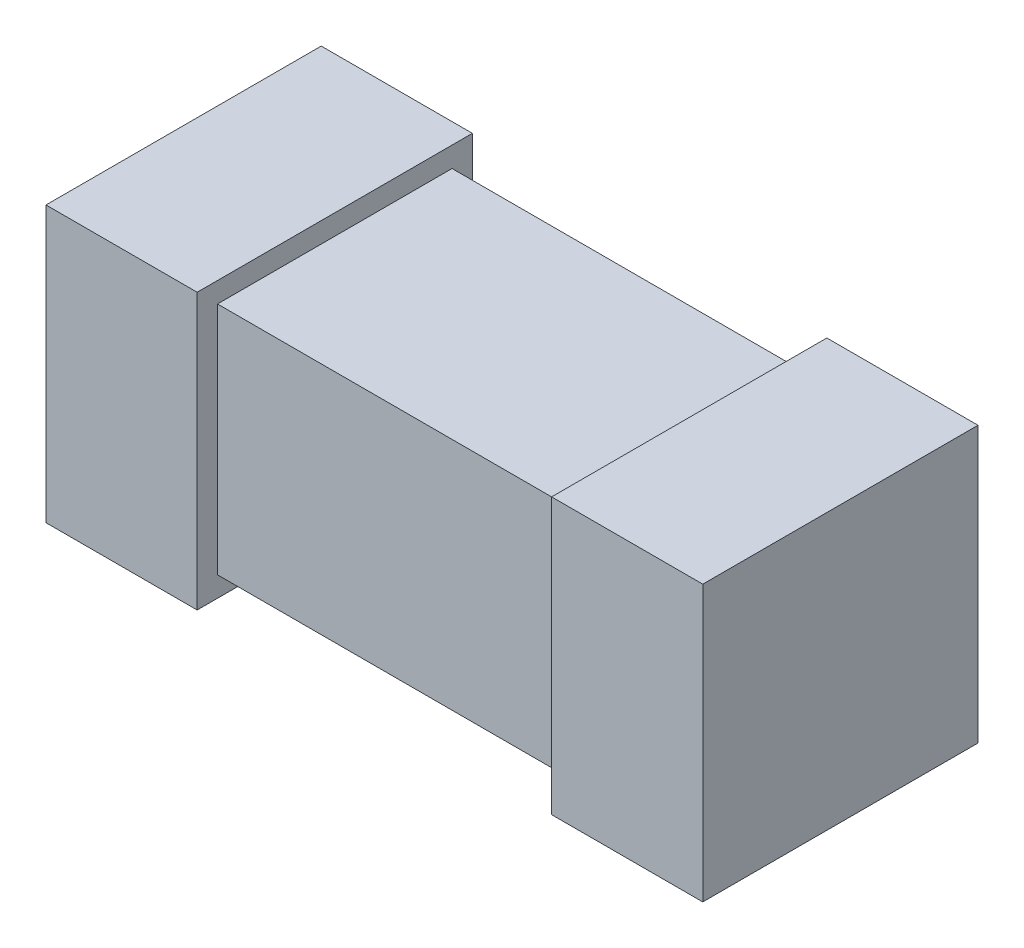
ISO-10303-21;
HEADER;
FILE_DESCRIPTION(('STEP AP214'),'2;1');
FILE_NAME('part.step','',(''),(''),'','','');
FILE_SCHEMA(('AUTOMOTIVE_DESIGN { 1 0 10303 214 1 1 1 1 }'));
ENDSEC;
DATA;
#1=APPLICATION_CONTEXT('core data for automotive mechanical design processes');
#2=APPLICATION_PROTOCOL_DEFINITION('international standard','automotive_design',2000,#1);
#3=PRODUCT_CONTEXT('',#1,'mechanical');
#4=PRODUCT('Part','Part','',(#3));
#5=PRODUCT_RELATED_PRODUCT_CATEGORY('part','',(#4));
#6=PRODUCT_DEFINITION_FORMATION('','',#4);
#7=PRODUCT_DEFINITION_CONTEXT('part definition',#1,'design');
#8=PRODUCT_DEFINITION('design','',#6,#7);
#9=PRODUCT_DEFINITION_SHAPE('','',#8);
#10=(LENGTH_UNIT() NAMED_UNIT(*) SI_UNIT(.MILLI.,.METRE.));
#11=(NAMED_UNIT(*) PLANE_ANGLE_UNIT() SI_UNIT($,.RADIAN.));
#12=(NAMED_UNIT(*) SI_UNIT($,.STERADIAN.) SOLID_ANGLE_UNIT());
#13=UNCERTAINTY_MEASURE_WITH_UNIT(LENGTH_MEASURE(1.E-05),#10,'distance_accuracy_value','');
#14=(GEOMETRIC_REPRESENTATION_CONTEXT(3) GLOBAL_UNCERTAINTY_ASSIGNED_CONTEXT((#13)) GLOBAL_UNIT_ASSIGNED_CONTEXT((#10,
#11,#12)) REPRESENTATION_CONTEXT('',''));
#15=CARTESIAN_POINT('',(0.,0.,0.));
#16=DIRECTION('',(0.,0.,1.));
#17=DIRECTION('',(1.,0.,0.));
#18=AXIS2_PLACEMENT_3D('',#15,#16,#17);
#19=CARTESIAN_POINT('',(1.7,1.125,-1.125));
#20=DIRECTION('',(0.,0.,1.));
#21=DIRECTION('',(0.,-1.,0.));
#22=AXIS2_PLACEMENT_3D('',#19,#20,#21);
#23=PLANE('',#22);
#24=DIRECTION('',(0.,1.,0.));
#25=VECTOR('',#24,1.);
#26=CARTESIAN_POINT('',(-1.7,1.125,-1.125));
#27=LINE('',#26,#25);
#28=CARTESIAN_POINT('',(-1.7,-1.125,-1.125));
#29=VERTEX_POINT('',#28);
#30=CARTESIAN_POINT('',(-1.7,1.125,-1.125));
#31=VERTEX_POINT('',#30);
#32=EDGE_CURVE('E190',#29,#31,#27,.T.);
#33=ORIENTED_EDGE('',*,*,#32,.T.);
#34=DIRECTION('',(-1.,0.,0.));
#35=VECTOR('',#34,1.);
#36=CARTESIAN_POINT('',(1.7,1.125,-1.125));
#37=LINE('',#36,#35);
#38=CARTESIAN_POINT('',(1.7,1.125,-1.125));
#39=VERTEX_POINT('',#38);
#40=EDGE_CURVE('E11',#39,#31,#37,.T.);
#41=ORIENTED_EDGE('',*,*,#40,.F.);
#42=DIRECTION('',(0.,1.,0.));
#43=VECTOR('',#42,1.);
#44=CARTESIAN_POINT('',(1.7,1.125,-1.125));
#45=LINE('',#44,#43);
#46=CARTESIAN_POINT('',(1.7,-1.125,-1.125));
#47=VERTEX_POINT('',#46);
#48=EDGE_CURVE('E191',#47,#39,#45,.T.);
#49=ORIENTED_EDGE('',*,*,#48,.F.);
#50=DIRECTION('',(-1.,0.,0.));
#51=VECTOR('',#50,1.);
#52=CARTESIAN_POINT('',(1.7,-1.125,-1.125));
#53=LINE('',#52,#51);
#54=EDGE_CURVE('E204',#47,#29,#53,.T.);
#55=ORIENTED_EDGE('',*,*,#54,.T.);
#56=EDGE_LOOP('',(#33,#41,#49,#55));
#57=FACE_BOUND('',#56,.T.);
#58=ADVANCED_FACE('F33',(#57),#23,.F.);
#59=CARTESIAN_POINT('',(1.7,1.125,1.125));
#60=DIRECTION('',(0.,-1.,0.));
#61=DIRECTION('',(0.,0.,-1.));
#62=AXIS2_PLACEMENT_3D('',#59,#60,#61);
#63=PLANE('',#62);
#64=DIRECTION('',(0.,0.,1.));
#65=VECTOR('',#64,1.);
#66=CARTESIAN_POINT('',(-1.7,1.125,1.125));
#67=LINE('',#66,#65);
#68=CARTESIAN_POINT('',(-1.7,1.125,1.125));
#69=VERTEX_POINT('',#68);
#70=EDGE_CURVE('E207',#31,#69,#67,.T.);
#71=ORIENTED_EDGE('',*,*,#70,.T.);
#72=DIRECTION('',(-1.,0.,0.));
#73=VECTOR('',#72,1.);
#74=CARTESIAN_POINT('',(1.7,1.125,1.125));
#75=LINE('',#74,#73);
#76=CARTESIAN_POINT('',(1.7,1.125,1.125));
#77=VERTEX_POINT('',#76);
#78=EDGE_CURVE('E41',#77,#69,#75,.T.);
#79=ORIENTED_EDGE('',*,*,#78,.F.);
#80=DIRECTION('',(0.,0.,1.));
#81=VECTOR('',#80,1.);
#82=CARTESIAN_POINT('',(1.7,1.125,1.125));
#83=LINE('',#82,#81);
#84=EDGE_CURVE('E194',#39,#77,#83,.T.);
#85=ORIENTED_EDGE('',*,*,#84,.F.);
#86=ORIENTED_EDGE('',*,*,#40,.T.);
#87=EDGE_LOOP('',(#71,#79,#85,#86));
#88=FACE_BOUND('',#87,.T.);
#89=ADVANCED_FACE('F219',(#88),#63,.F.);
#90=CARTESIAN_POINT('',(1.7,1.125,1.125));
#91=DIRECTION('',(0.,0.,-1.));
#92=DIRECTION('',(0.,1.,0.));
#93=AXIS2_PLACEMENT_3D('',#90,#91,#92);
#94=PLANE('',#93);
#95=DIRECTION('',(0.,-1.,0.));
#96=VECTOR('',#95,1.);
#97=CARTESIAN_POINT('',(-1.7,1.125,1.125));
#98=LINE('',#97,#96);
#99=CARTESIAN_POINT('',(-1.7,-1.125,1.125));
#100=VERTEX_POINT('',#99);
#101=EDGE_CURVE('E210',#69,#100,#98,.T.);
#102=ORIENTED_EDGE('',*,*,#101,.T.);
#103=DIRECTION('',(-1.,0.,0.));
#104=VECTOR('',#103,1.);
#105=CARTESIAN_POINT('',(1.7,-1.125,1.125));
#106=LINE('',#105,#104);
#107=CARTESIAN_POINT('',(1.7,-1.125,1.125));
#108=VERTEX_POINT('',#107);
#109=EDGE_CURVE('E48',#108,#100,#106,.T.);
#110=ORIENTED_EDGE('',*,*,#109,.F.);
#111=DIRECTION('',(0.,-1.,0.));
#112=VECTOR('',#111,1.);
#113=CARTESIAN_POINT('',(1.7,1.125,1.125));
#114=LINE('',#113,#112);
#115=EDGE_CURVE('E198',#77,#108,#114,.T.);
#116=ORIENTED_EDGE('',*,*,#115,.F.);
#117=ORIENTED_EDGE('',*,*,#78,.T.);
#118=EDGE_LOOP('',(#102,#110,#116,#117));
#119=FACE_BOUND('',#118,.T.);
#120=ADVANCED_FACE('F217',(#119),#94,.F.);
#121=CARTESIAN_POINT('',(1.7,-1.125,1.125));
#122=DIRECTION('',(0.,1.,0.));
#123=DIRECTION('',(0.,0.,1.));
#124=AXIS2_PLACEMENT_3D('',#121,#122,#123);
#125=PLANE('',#124);
#126=DIRECTION('',(0.,0.,-1.));
#127=VECTOR('',#126,1.);
#128=CARTESIAN_POINT('',(-1.7,-1.125,1.125));
#129=LINE('',#128,#127);
#130=EDGE_CURVE('E195',#100,#29,#129,.T.);
#131=ORIENTED_EDGE('',*,*,#130,.T.);
#132=ORIENTED_EDGE('',*,*,#54,.F.);
#133=DIRECTION('',(0.,0.,-1.));
#134=VECTOR('',#133,1.);
#135=CARTESIAN_POINT('',(1.7,-1.125,1.125));
#136=LINE('',#135,#134);
#137=EDGE_CURVE('E201',#108,#47,#136,.T.);
#138=ORIENTED_EDGE('',*,*,#137,.F.);
#139=ORIENTED_EDGE('',*,*,#109,.T.);
#140=EDGE_LOOP('',(#131,#132,#138,#139));
#141=FACE_BOUND('',#140,.T.);
#142=ADVANCED_FACE('F226',(#141),#125,.F.);
#143=CARTESIAN_POINT('',(1.7,0.,0.));
#144=DIRECTION('',(1.,0.,0.));
#145=DIRECTION('',(0.,0.,-1.));
#146=AXIS2_PLACEMENT_3D('',#143,#144,#145);
#147=PLANE('',#146);
#148=DIRECTION('',(0.,1.,0.));
#149=VECTOR('',#148,1.);
#150=CARTESIAN_POINT('',(1.7,1.32,-1.32));
#151=LINE('',#150,#149);
#152=CARTESIAN_POINT('',(1.7,-1.32,-1.32));
#153=VERTEX_POINT('',#152);
#154=CARTESIAN_POINT('',(1.7,1.32,-1.32));
#155=VERTEX_POINT('',#154);
#156=EDGE_CURVE('E129',#153,#155,#151,.T.);
#157=ORIENTED_EDGE('',*,*,#156,.F.);
#158=DIRECTION('',(0.,0.,-1.));
#159=VECTOR('',#158,1.);
#160=CARTESIAN_POINT('',(1.7,-1.32,1.32));
#161=LINE('',#160,#159);
#162=CARTESIAN_POINT('',(1.7,-1.32,1.32));
#163=VERTEX_POINT('',#162);
#164=EDGE_CURVE('E165',#163,#153,#161,.T.);
#165=ORIENTED_EDGE('',*,*,#164,.F.);
#166=DIRECTION('',(0.,-1.,0.));
#167=VECTOR('',#166,1.);
#168=CARTESIAN_POINT('',(1.7,1.32,1.32));
#169=LINE('',#168,#167);
#170=CARTESIAN_POINT('',(1.7,1.32,1.32));
#171=VERTEX_POINT('',#170);
#172=EDGE_CURVE('E176',#171,#163,#169,.T.);
#173=ORIENTED_EDGE('',*,*,#172,.F.);
#174=DIRECTION('',(0.,0.,1.));
#175=VECTOR('',#174,1.);
#176=CARTESIAN_POINT('',(1.7,1.32,1.32));
#177=LINE('',#176,#175);
#178=EDGE_CURVE('E174',#155,#171,#177,.T.);
#179=ORIENTED_EDGE('',*,*,#178,.F.);
#180=EDGE_LOOP('',(#157,#165,#173,#179));
#181=FACE_BOUND('',#180,.T.);
#182=ORIENTED_EDGE('',*,*,#137,.T.);
#183=ORIENTED_EDGE('',*,*,#48,.T.);
#184=ORIENTED_EDGE('',*,*,#84,.T.);
#185=ORIENTED_EDGE('',*,*,#115,.T.);
#186=EDGE_LOOP('',(#182,#183,#184,#185));
#187=FACE_BOUND('',#186,.T.);
#188=ADVANCED_FACE('F229',(#181,#187),#147,.F.);
#189=CARTESIAN_POINT('',(3.15,1.32,-1.32));
#190=DIRECTION('',(0.,0.,1.));
#191=DIRECTION('',(1.,0.,0.));
#192=AXIS2_PLACEMENT_3D('',#189,#190,#191);
#193=PLANE('',#192);
#194=ORIENTED_EDGE('',*,*,#156,.T.);
#195=DIRECTION('',(-1.,0.,0.));
#196=VECTOR('',#195,1.);
#197=CARTESIAN_POINT('',(3.15,1.32,-1.32));
#198=LINE('',#197,#196);
#199=CARTESIAN_POINT('',(3.15,1.32,-1.32));
#200=VERTEX_POINT('',#199);
#201=EDGE_CURVE('E187',#200,#155,#198,.T.);
#202=ORIENTED_EDGE('',*,*,#201,.F.);
#203=DIRECTION('',(0.,1.,0.));
#204=VECTOR('',#203,1.);
#205=CARTESIAN_POINT('',(3.15,1.32,-1.32));
#206=LINE('',#205,#204);
#207=CARTESIAN_POINT('',(3.15,-1.32,-1.32));
#208=VERTEX_POINT('',#207);
#209=EDGE_CURVE('E161',#208,#200,#206,.T.);
#210=ORIENTED_EDGE('',*,*,#209,.F.);
#211=DIRECTION('',(-1.,0.,0.));
#212=VECTOR('',#211,1.);
#213=CARTESIAN_POINT('',(3.15,-1.32,-1.32));
#214=LINE('',#213,#212);
#215=EDGE_CURVE('E171',#208,#153,#214,.T.);
#216=ORIENTED_EDGE('',*,*,#215,.T.);
#217=EDGE_LOOP('',(#194,#202,#210,#216));
#218=FACE_BOUND('',#217,.T.);
#219=ADVANCED_FACE('F231',(#218),#193,.F.);
#220=CARTESIAN_POINT('',(3.15,1.32,1.32));
#221=DIRECTION('',(0.,-1.,0.));
#222=DIRECTION('',(0.,0.,-1.));
#223=AXIS2_PLACEMENT_3D('',#220,#221,#222);
#224=PLANE('',#223);
#225=ORIENTED_EDGE('',*,*,#178,.T.);
#226=DIRECTION('',(-1.,0.,0.));
#227=VECTOR('',#226,1.);
#228=CARTESIAN_POINT('',(3.15,1.32,1.32));
#229=LINE('',#228,#227);
#230=CARTESIAN_POINT('',(3.15,1.32,1.32));
#231=VERTEX_POINT('',#230);
#232=EDGE_CURVE('E184',#231,#171,#229,.T.);
#233=ORIENTED_EDGE('',*,*,#232,.F.);
#234=DIRECTION('',(0.,0.,1.));
#235=VECTOR('',#234,1.);
#236=CARTESIAN_POINT('',(3.15,1.32,1.32));
#237=LINE('',#236,#235);
#238=EDGE_CURVE('E164',#200,#231,#237,.T.);
#239=ORIENTED_EDGE('',*,*,#238,.F.);
#240=ORIENTED_EDGE('',*,*,#201,.T.);
#241=EDGE_LOOP('',(#225,#233,#239,#240));
#242=FACE_BOUND('',#241,.T.);
#243=ADVANCED_FACE('F238',(#242),#224,.F.);
#244=CARTESIAN_POINT('',(3.15,1.32,1.32));
#245=DIRECTION('',(0.,0.,-1.));
#246=DIRECTION('',(0.,1.,0.));
#247=AXIS2_PLACEMENT_3D('',#244,#245,#246);
#248=PLANE('',#247);
#249=ORIENTED_EDGE('',*,*,#172,.T.);
#250=DIRECTION('',(-1.,0.,0.));
#251=VECTOR('',#250,1.);
#252=CARTESIAN_POINT('',(3.15,-1.32,1.32));
#253=LINE('',#252,#251);
#254=CARTESIAN_POINT('',(3.15,-1.32,1.32));
#255=VERTEX_POINT('',#254);
#256=EDGE_CURVE('E181',#255,#163,#253,.T.);
#257=ORIENTED_EDGE('',*,*,#256,.F.);
#258=DIRECTION('',(0.,-1.,0.));
#259=VECTOR('',#258,1.);
#260=CARTESIAN_POINT('',(3.15,1.32,1.32));
#261=LINE('',#260,#259);
#262=EDGE_CURVE('E167',#231,#255,#261,.T.);
#263=ORIENTED_EDGE('',*,*,#262,.F.);
#264=ORIENTED_EDGE('',*,*,#232,.T.);
#265=EDGE_LOOP('',(#249,#257,#263,#264));
#266=FACE_BOUND('',#265,.T.);
#267=ADVANCED_FACE('F256',(#266),#248,.F.);
#268=CARTESIAN_POINT('',(3.15,-1.32,1.32));
#269=DIRECTION('',(0.,1.,0.));
#270=DIRECTION('',(0.,0.,1.));
#271=AXIS2_PLACEMENT_3D('',#268,#269,#270);
#272=PLANE('',#271);
#273=ORIENTED_EDGE('',*,*,#164,.T.);
#274=ORIENTED_EDGE('',*,*,#215,.F.);
#275=DIRECTION('',(0.,0.,-1.));
#276=VECTOR('',#275,1.);
#277=CARTESIAN_POINT('',(3.15,-1.32,1.32));
#278=LINE('',#277,#276);
#279=EDGE_CURVE('E169',#255,#208,#278,.T.);
#280=ORIENTED_EDGE('',*,*,#279,.F.);
#281=ORIENTED_EDGE('',*,*,#256,.T.);
#282=EDGE_LOOP('',(#273,#274,#280,#281));
#283=FACE_BOUND('',#282,.T.);
#284=ADVANCED_FACE('F259',(#283),#272,.F.);
#285=CARTESIAN_POINT('',(3.15,0.,0.));
#286=DIRECTION('',(1.,0.,0.));
#287=DIRECTION('',(0.,0.,-1.));
#288=AXIS2_PLACEMENT_3D('',#285,#286,#287);
#289=PLANE('',#288);
#290=ORIENTED_EDGE('',*,*,#209,.T.);
#291=ORIENTED_EDGE('',*,*,#238,.T.);
#292=ORIENTED_EDGE('',*,*,#262,.T.);
#293=ORIENTED_EDGE('',*,*,#279,.T.);
#294=EDGE_LOOP('',(#290,#291,#292,#293));
#295=FACE_BOUND('',#294,.T.);
#296=ADVANCED_FACE('F262',(#295),#289,.T.);
#297=CARTESIAN_POINT('',(-1.7,0.,0.));
#298=DIRECTION('',(-1.,0.,0.));
#299=DIRECTION('',(0.,0.,-1.));
#300=AXIS2_PLACEMENT_3D('',#297,#298,#299);
#301=PLANE('',#300);
#302=DIRECTION('',(0.,1.,0.));
#303=VECTOR('',#302,1.);
#304=CARTESIAN_POINT('',(-1.7,1.32,-1.32));
#305=LINE('',#304,#303);
#306=CARTESIAN_POINT('',(-1.7,-1.32,-1.32));
#307=VERTEX_POINT('',#306);
#308=CARTESIAN_POINT('',(-1.7,1.32,-1.32));
#309=VERTEX_POINT('',#308);
#310=EDGE_CURVE('E124',#307,#309,#305,.T.);
#311=ORIENTED_EDGE('',*,*,#310,.T.);
#312=DIRECTION('',(0.,0.,1.));
#313=VECTOR('',#312,1.);
#314=CARTESIAN_POINT('',(-1.7,1.32,1.32));
#315=LINE('',#314,#313);
#316=CARTESIAN_POINT('',(-1.7,1.32,1.32));
#317=VERTEX_POINT('',#316);
#318=EDGE_CURVE('E140',#309,#317,#315,.T.);
#319=ORIENTED_EDGE('',*,*,#318,.T.);
#320=DIRECTION('',(0.,-1.,0.));
#321=VECTOR('',#320,1.);
#322=CARTESIAN_POINT('',(-1.7,1.32,1.32));
#323=LINE('',#322,#321);
#324=CARTESIAN_POINT('',(-1.7,-1.32,1.32));
#325=VERTEX_POINT('',#324);
#326=EDGE_CURVE('E152',#317,#325,#323,.T.);
#327=ORIENTED_EDGE('',*,*,#326,.T.);
#328=DIRECTION('',(0.,0.,-1.));
#329=VECTOR('',#328,1.);
#330=CARTESIAN_POINT('',(-1.7,-1.32,1.32));
#331=LINE('',#330,#329);
#332=EDGE_CURVE('E150',#325,#307,#331,.T.);
#333=ORIENTED_EDGE('',*,*,#332,.T.);
#334=EDGE_LOOP('',(#311,#319,#327,#333));
#335=FACE_BOUND('',#334,.T.);
#336=ORIENTED_EDGE('',*,*,#70,.F.);
#337=ORIENTED_EDGE('',*,*,#32,.F.);
#338=ORIENTED_EDGE('',*,*,#130,.F.);
#339=ORIENTED_EDGE('',*,*,#101,.F.);
#340=EDGE_LOOP('',(#336,#337,#338,#339));
#341=FACE_BOUND('',#340,.T.);
#342=ADVANCED_FACE('F223',(#335,#341),#301,.F.);
#343=CARTESIAN_POINT('',(-3.15,1.32,-1.32));
#344=DIRECTION('',(0.,0.,-1.));
#345=DIRECTION('',(-1.,0.,0.));
#346=AXIS2_PLACEMENT_3D('',#343,#344,#345);
#347=PLANE('',#346);
#348=ORIENTED_EDGE('',*,*,#310,.F.);
#349=DIRECTION('',(1.,0.,0.));
#350=VECTOR('',#349,1.);
#351=CARTESIAN_POINT('',(-3.15,-1.32,-1.32));
#352=LINE('',#351,#350);
#353=CARTESIAN_POINT('',(-3.15,-1.32,-1.32));
#354=VERTEX_POINT('',#353);
#355=EDGE_CURVE('E118',#354,#307,#352,.T.);
#356=ORIENTED_EDGE('',*,*,#355,.F.);
#357=DIRECTION('',(0.,1.,0.));
#358=VECTOR('',#357,1.);
#359=CARTESIAN_POINT('',(-3.15,1.32,-1.32));
#360=LINE('',#359,#358);
#361=CARTESIAN_POINT('',(-3.15,1.32,-1.32));
#362=VERTEX_POINT('',#361);
#363=EDGE_CURVE('E121',#354,#362,#360,.T.);
#364=ORIENTED_EDGE('',*,*,#363,.T.);
#365=DIRECTION('',(1.,0.,0.));
#366=VECTOR('',#365,1.);
#367=CARTESIAN_POINT('',(-3.15,1.32,-1.32));
#368=LINE('',#367,#366);
#369=EDGE_CURVE('E148',#362,#309,#368,.T.);
#370=ORIENTED_EDGE('',*,*,#369,.T.);
#371=EDGE_LOOP('',(#348,#356,#364,#370));
#372=FACE_BOUND('',#371,.T.);
#373=ADVANCED_FACE('F120',(#372),#347,.T.);
#374=CARTESIAN_POINT('',(-3.15,-1.32,1.32));
#375=DIRECTION('',(0.,-1.,0.));
#376=DIRECTION('',(0.,0.,-1.));
#377=AXIS2_PLACEMENT_3D('',#374,#375,#376);
#378=PLANE('',#377);
#379=ORIENTED_EDGE('',*,*,#332,.F.);
#380=DIRECTION('',(1.,0.,0.));
#381=VECTOR('',#380,1.);
#382=CARTESIAN_POINT('',(-3.15,-1.32,1.32));
#383=LINE('',#382,#381);
#384=CARTESIAN_POINT('',(-3.15,-1.32,1.32));
#385=VERTEX_POINT('',#384);
#386=EDGE_CURVE('E130',#385,#325,#383,.T.);
#387=ORIENTED_EDGE('',*,*,#386,.F.);
#388=DIRECTION('',(0.,0.,-1.));
#389=VECTOR('',#388,1.);
#390=CARTESIAN_POINT('',(-3.15,-1.32,1.32));
#391=LINE('',#390,#389);
#392=EDGE_CURVE('E136',#385,#354,#391,.T.);
#393=ORIENTED_EDGE('',*,*,#392,.T.);
#394=ORIENTED_EDGE('',*,*,#355,.T.);
#395=EDGE_LOOP('',(#379,#387,#393,#394));
#396=FACE_BOUND('',#395,.T.);
#397=ADVANCED_FACE('F142',(#396),#378,.T.);
#398=CARTESIAN_POINT('',(-3.15,1.32,1.32));
#399=DIRECTION('',(0.,0.,1.));
#400=DIRECTION('',(0.,-1.,0.));
#401=AXIS2_PLACEMENT_3D('',#398,#399,#400);
#402=PLANE('',#401);
#403=ORIENTED_EDGE('',*,*,#326,.F.);
#404=DIRECTION('',(1.,0.,0.));
#405=VECTOR('',#404,1.);
#406=CARTESIAN_POINT('',(-3.15,1.32,1.32));
#407=LINE('',#406,#405);
#408=CARTESIAN_POINT('',(-3.15,1.32,1.32));
#409=VERTEX_POINT('',#408);
#410=EDGE_CURVE('E158',#409,#317,#407,.T.);
#411=ORIENTED_EDGE('',*,*,#410,.F.);
#412=DIRECTION('',(0.,-1.,0.));
#413=VECTOR('',#412,1.);
#414=CARTESIAN_POINT('',(-3.15,1.32,1.32));
#415=LINE('',#414,#413);
#416=EDGE_CURVE('E143',#409,#385,#415,.T.);
#417=ORIENTED_EDGE('',*,*,#416,.T.);
#418=ORIENTED_EDGE('',*,*,#386,.T.);
#419=EDGE_LOOP('',(#403,#411,#417,#418));
#420=FACE_BOUND('',#419,.T.);
#421=ADVANCED_FACE('F287',(#420),#402,.T.);
#422=CARTESIAN_POINT('',(-3.15,1.32,1.32));
#423=DIRECTION('',(0.,1.,0.));
#424=DIRECTION('',(0.,0.,1.));
#425=AXIS2_PLACEMENT_3D('',#422,#423,#424);
#426=PLANE('',#425);
#427=ORIENTED_EDGE('',*,*,#318,.F.);
#428=ORIENTED_EDGE('',*,*,#369,.F.);
#429=DIRECTION('',(0.,0.,1.));
#430=VECTOR('',#429,1.);
#431=CARTESIAN_POINT('',(-3.15,1.32,1.32));
#432=LINE('',#431,#430);
#433=EDGE_CURVE('E139',#362,#409,#432,.T.);
#434=ORIENTED_EDGE('',*,*,#433,.T.);
#435=ORIENTED_EDGE('',*,*,#410,.T.);
#436=EDGE_LOOP('',(#427,#428,#434,#435));
#437=FACE_BOUND('',#436,.T.);
#438=ADVANCED_FACE('F290',(#437),#426,.T.);
#439=CARTESIAN_POINT('',(-3.15,0.,0.));
#440=DIRECTION('',(-1.,0.,0.));
#441=DIRECTION('',(0.,0.,-1.));
#442=AXIS2_PLACEMENT_3D('',#439,#440,#441);
#443=PLANE('',#442);
#444=ORIENTED_EDGE('',*,*,#363,.F.);
#445=ORIENTED_EDGE('',*,*,#392,.F.);
#446=ORIENTED_EDGE('',*,*,#416,.F.);
#447=ORIENTED_EDGE('',*,*,#433,.F.);
#448=EDGE_LOOP('',(#444,#445,#446,#447));
#449=FACE_BOUND('',#448,.T.);
#450=ADVANCED_FACE('F134',(#449),#443,.T.);
#451=CLOSED_SHELL('',(#58,#89,#120,#142,#188,#219,#243,#267,#284,#296,#342,#373,#397,#421,#438,#450));
#452=MANIFOLD_SOLID_BREP('B2',#451);
#453=ADVANCED_BREP_SHAPE_REPRESENTATION('',(#18,#452),#14);
#454=SHAPE_DEFINITION_REPRESENTATION(#9,#453);
ENDSEC;
END-ISO-10303-21;
